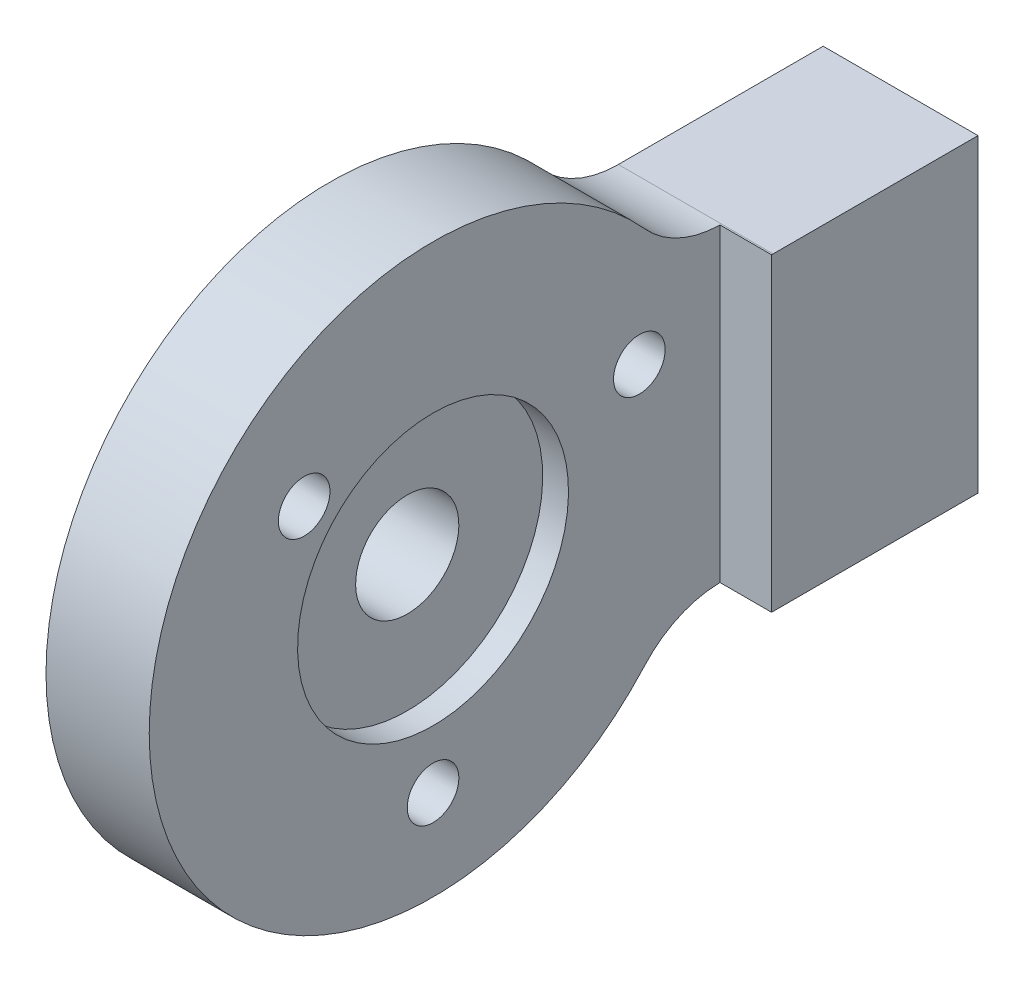
ISO-10303-21;
HEADER;
FILE_DESCRIPTION(('STEP AP214'),'2;1');
FILE_NAME('part.step','',(''),(''),'','','');
FILE_SCHEMA(('AUTOMOTIVE_DESIGN { 1 0 10303 214 1 1 1 1 }'));
ENDSEC;
DATA;
#1=APPLICATION_CONTEXT('core data for automotive mechanical design processes');
#2=APPLICATION_PROTOCOL_DEFINITION('international standard','automotive_design',2000,#1);
#3=PRODUCT_CONTEXT('',#1,'mechanical');
#4=PRODUCT('Part','Part','',(#3));
#5=PRODUCT_RELATED_PRODUCT_CATEGORY('part','',(#4));
#6=PRODUCT_DEFINITION_FORMATION('','',#4);
#7=PRODUCT_DEFINITION_CONTEXT('part definition',#1,'design');
#8=PRODUCT_DEFINITION('design','',#6,#7);
#9=PRODUCT_DEFINITION_SHAPE('','',#8);
#10=(LENGTH_UNIT() NAMED_UNIT(*) SI_UNIT(.MILLI.,.METRE.));
#11=(NAMED_UNIT(*) PLANE_ANGLE_UNIT() SI_UNIT($,.RADIAN.));
#12=(NAMED_UNIT(*) SI_UNIT($,.STERADIAN.) SOLID_ANGLE_UNIT());
#13=UNCERTAINTY_MEASURE_WITH_UNIT(LENGTH_MEASURE(1.E-05),#10,'distance_accuracy_value','');
#14=(GEOMETRIC_REPRESENTATION_CONTEXT(3) GLOBAL_UNCERTAINTY_ASSIGNED_CONTEXT((#13)) GLOBAL_UNIT_ASSIGNED_CONTEXT((#10,
#11,#12)) REPRESENTATION_CONTEXT('',''));
#15=CARTESIAN_POINT('',(0.,0.,0.));
#16=DIRECTION('',(0.,0.,1.));
#17=DIRECTION('',(1.,0.,0.));
#18=AXIS2_PLACEMENT_3D('',#15,#16,#17);
#19=CARTESIAN_POINT('',(-2.,6.,8.));
#20=DIRECTION('',(1.,0.,0.));
#21=DIRECTION('',(0.,1.,0.));
#22=AXIS2_PLACEMENT_3D('',#19,#20,#21);
#23=PLANE('',#22);
#24=CARTESIAN_POINT('',(-2.,0.,19.12));
#25=DIRECTION('',(1.,0.,0.));
#26=DIRECTION('',(0.,1.,0.));
#27=AXIS2_PLACEMENT_3D('',#24,#25,#26);
#28=CIRCLE('',#27,2.);
#29=CARTESIAN_POINT('',(-2.,2.,19.12));
#30=VERTEX_POINT('',#29);
#31=EDGE_CURVE('E122',#30,#30,#28,.F.);
#32=ORIENTED_EDGE('',*,*,#31,.F.);
#33=EDGE_LOOP('',(#32));
#34=FACE_BOUND('',#33,.T.);
#35=CARTESIAN_POINT('',(-2.,2.8839745962155,11.1248094716167));
#36=DIRECTION('',(-1.,0.,0.));
#37=DIRECTION('',(0.,0.499999999999992,-0.866025403784443));
#38=AXIS2_PLACEMENT_3D('',#35,#36,#37);
#39=CIRCLE('',#38,1.);
#40=CARTESIAN_POINT('',(-2.,3.38397459621549,10.2587840678322));
#41=VERTEX_POINT('',#40);
#42=EDGE_CURVE('E125',#41,#41,#39,.T.);
#43=ORIENTED_EDGE('',*,*,#42,.F.);
#44=EDGE_LOOP('',(#43));
#45=FACE_BOUND('',#44,.T.);
#46=CARTESIAN_POINT('',(-2.,4.61602540378447,24.1151905283833));
#47=DIRECTION('',(-1.,0.,0.));
#48=DIRECTION('',(0.,0.500000000000004,0.866025403784436));
#49=AXIS2_PLACEMENT_3D('',#46,#47,#48);
#50=CIRCLE('',#49,1.);
#51=CARTESIAN_POINT('',(-2.,5.11602540378447,24.9812159321677));
#52=VERTEX_POINT('',#51);
#53=EDGE_CURVE('E131',#52,#52,#50,.T.);
#54=ORIENTED_EDGE('',*,*,#53,.F.);
#55=EDGE_LOOP('',(#54));
#56=FACE_BOUND('',#55,.T.);
#57=CARTESIAN_POINT('',(-2.,-7.5,19.12));
#58=DIRECTION('',(-1.,0.,0.));
#59=DIRECTION('',(0.,-1.,0.));
#60=AXIS2_PLACEMENT_3D('',#57,#58,#59);
#61=CIRCLE('',#60,1.);
#62=CARTESIAN_POINT('',(-2.,-8.5,19.12));
#63=VERTEX_POINT('',#62);
#64=EDGE_CURVE('E137',#63,#63,#61,.T.);
#65=ORIENTED_EDGE('',*,*,#64,.F.);
#66=EDGE_LOOP('',(#65));
#67=FACE_BOUND('',#66,.T.);
#68=DIRECTION('',(0.,0.,-1.));
#69=VECTOR('',#68,1.);
#70=CARTESIAN_POINT('',(-2.,-6.,8.));
#71=LINE('',#70,#69);
#72=CARTESIAN_POINT('',(-2.,-6.,7.93966011250105));
#73=VERTEX_POINT('',#72);
#74=CARTESIAN_POINT('',(-2.,-6.,0.));
#75=VERTEX_POINT('',#74);
#76=EDGE_CURVE('E181',#73,#75,#71,.T.);
#77=ORIENTED_EDGE('',*,*,#76,.F.);
#78=CARTESIAN_POINT('',(-2.,-10.,7.93966011250105));
#79=DIRECTION('',(1.,0.,0.));
#80=DIRECTION('',(0.,1.,0.));
#81=AXIS2_PLACEMENT_3D('',#78,#79,#80);
#82=CIRCLE('',#81,4.);
#83=CARTESIAN_POINT('',(-2.,-7.33333333333333,10.9210840825008));
#84=VERTEX_POINT('',#83);
#85=EDGE_CURVE('E199',#73,#84,#82,.T.);
#86=ORIENTED_EDGE('',*,*,#85,.T.);
#87=CARTESIAN_POINT('',(-2.,0.,19.12));
#88=DIRECTION('',(1.,0.,0.));
#89=DIRECTION('',(0.,1.,0.));
#90=AXIS2_PLACEMENT_3D('',#87,#88,#89);
#91=CIRCLE('',#90,11.);
#92=CARTESIAN_POINT('',(-2.,7.33333333333333,10.9210840825008));
#93=VERTEX_POINT('',#92);
#94=EDGE_CURVE('E150',#93,#84,#91,.T.);
#95=ORIENTED_EDGE('',*,*,#94,.F.);
#96=CARTESIAN_POINT('',(-2.,10.,7.93966011250105));
#97=DIRECTION('',(1.,0.,0.));
#98=DIRECTION('',(0.,1.,0.));
#99=AXIS2_PLACEMENT_3D('',#96,#97,#98);
#100=CIRCLE('',#99,4.);
#101=CARTESIAN_POINT('',(-2.,6.,7.93966011250105));
#102=VERTEX_POINT('',#101);
#103=EDGE_CURVE('E11',#93,#102,#100,.T.);
#104=ORIENTED_EDGE('',*,*,#103,.T.);
#105=DIRECTION('',(0.,0.,-1.));
#106=VECTOR('',#105,1.);
#107=CARTESIAN_POINT('',(-2.,6.,8.));
#108=LINE('',#107,#106);
#109=CARTESIAN_POINT('',(-2.,6.,0.));
#110=VERTEX_POINT('',#109);
#111=EDGE_CURVE('E164',#102,#110,#108,.T.);
#112=ORIENTED_EDGE('',*,*,#111,.T.);
#113=DIRECTION('',(0.,-1.,0.));
#114=VECTOR('',#113,1.);
#115=CARTESIAN_POINT('',(-2.,6.,0.));
#116=LINE('',#115,#114);
#117=EDGE_CURVE('E162',#110,#75,#116,.T.);
#118=ORIENTED_EDGE('',*,*,#117,.T.);
#119=EDGE_LOOP('',(#77,#86,#95,#104,#112,#118));
#120=FACE_BOUND('',#119,.T.);
#121=ADVANCED_FACE('F36',(#34,#45,#56,#67,#120),#23,.F.);
#122=CARTESIAN_POINT('',(-2.,-6.,8.));
#123=DIRECTION('',(0.,1.,0.));
#124=DIRECTION('',(0.,0.,1.));
#125=AXIS2_PLACEMENT_3D('',#122,#123,#124);
#126=PLANE('',#125);
#127=DIRECTION('',(0.,0.,-1.));
#128=VECTOR('',#127,1.);
#129=CARTESIAN_POINT('',(4.,-6.,8.));
#130=LINE('',#129,#128);
#131=CARTESIAN_POINT('',(4.,-6.,7.93966011250105));
#132=VERTEX_POINT('',#131);
#133=CARTESIAN_POINT('',(4.,-6.,0.));
#134=VERTEX_POINT('',#133);
#135=EDGE_CURVE('E179',#132,#134,#130,.T.);
#136=ORIENTED_EDGE('',*,*,#135,.F.);
#137=DIRECTION('',(1.,0.,0.));
#138=VECTOR('',#137,1.);
#139=CARTESIAN_POINT('',(-2.,-6.,7.93966011250105));
#140=LINE('',#139,#138);
#141=EDGE_CURVE('E188',#132,#73,#140,.F.);
#142=ORIENTED_EDGE('',*,*,#141,.T.);
#143=ORIENTED_EDGE('',*,*,#76,.T.);
#144=DIRECTION('',(1.,0.,0.));
#145=VECTOR('',#144,1.);
#146=CARTESIAN_POINT('',(-2.,-6.,0.));
#147=LINE('',#146,#145);
#148=EDGE_CURVE('E168',#75,#134,#147,.T.);
#149=ORIENTED_EDGE('',*,*,#148,.T.);
#150=EDGE_LOOP('',(#136,#142,#143,#149));
#151=FACE_BOUND('',#150,.T.);
#152=ADVANCED_FACE('F238',(#151),#126,.F.);
#153=CARTESIAN_POINT('',(4.,6.,8.));
#154=DIRECTION('',(-1.,0.,0.));
#155=DIRECTION('',(0.,-1.,0.));
#156=AXIS2_PLACEMENT_3D('',#153,#154,#155);
#157=PLANE('',#156);
#158=DIRECTION('',(0.,1.,0.));
#159=VECTOR('',#158,1.);
#160=CARTESIAN_POINT('',(4.,6.,0.));
#161=LINE('',#160,#159);
#162=CARTESIAN_POINT('',(4.,6.,0.));
#163=VERTEX_POINT('',#162);
#164=EDGE_CURVE('E171',#134,#163,#161,.T.);
#165=ORIENTED_EDGE('',*,*,#164,.T.);
#166=DIRECTION('',(0.,0.,-1.));
#167=VECTOR('',#166,1.);
#168=CARTESIAN_POINT('',(4.,6.,8.));
#169=LINE('',#168,#167);
#170=CARTESIAN_POINT('',(4.,6.,7.93966011250105));
#171=VERTEX_POINT('',#170);
#172=EDGE_CURVE('E177',#171,#163,#169,.T.);
#173=ORIENTED_EDGE('',*,*,#172,.F.);
#174=CARTESIAN_POINT('',(4.,10.,7.93966011250105));
#175=DIRECTION('',(-1.,0.,0.));
#176=DIRECTION('',(0.,-1.,0.));
#177=AXIS2_PLACEMENT_3D('',#174,#175,#176);
#178=CIRCLE('',#177,4.);
#179=CARTESIAN_POINT('',(4.,6.00045513864682,8.));
#180=VERTEX_POINT('',#179);
#181=EDGE_CURVE('E201',#171,#180,#178,.T.);
#182=ORIENTED_EDGE('',*,*,#181,.T.);
#183=DIRECTION('',(0.,1.,0.));
#184=VECTOR('',#183,1.);
#185=CARTESIAN_POINT('',(4.,6.,8.));
#186=LINE('',#185,#184);
#187=CARTESIAN_POINT('',(4.,-6.00045513864682,8.));
#188=VERTEX_POINT('',#187);
#189=EDGE_CURVE('E58',#188,#180,#186,.T.);
#190=ORIENTED_EDGE('',*,*,#189,.F.);
#191=CARTESIAN_POINT('',(4.,-10.,7.93966011250105));
#192=DIRECTION('',(-1.,0.,0.));
#193=DIRECTION('',(0.,-1.,0.));
#194=AXIS2_PLACEMENT_3D('',#191,#192,#193);
#195=CIRCLE('',#194,4.);
#196=EDGE_CURVE('E197',#188,#132,#195,.T.);
#197=ORIENTED_EDGE('',*,*,#196,.T.);
#198=ORIENTED_EDGE('',*,*,#135,.T.);
#199=EDGE_LOOP('',(#165,#173,#182,#190,#197,#198));
#200=FACE_BOUND('',#199,.T.);
#201=ADVANCED_FACE('F236',(#200),#157,.F.);
#202=CARTESIAN_POINT('',(-2.,6.,8.));
#203=DIRECTION('',(0.,-1.,0.));
#204=DIRECTION('',(0.,0.,-1.));
#205=AXIS2_PLACEMENT_3D('',#202,#203,#204);
#206=PLANE('',#205);
#207=ORIENTED_EDGE('',*,*,#111,.F.);
#208=DIRECTION('',(1.,0.,0.));
#209=VECTOR('',#208,1.);
#210=CARTESIAN_POINT('',(-2.,6.,7.93966011250105));
#211=LINE('',#210,#209);
#212=EDGE_CURVE('E190',#102,#171,#211,.T.);
#213=ORIENTED_EDGE('',*,*,#212,.T.);
#214=ORIENTED_EDGE('',*,*,#172,.T.);
#215=DIRECTION('',(-1.,0.,0.));
#216=VECTOR('',#215,1.);
#217=CARTESIAN_POINT('',(-2.,6.,0.));
#218=LINE('',#217,#216);
#219=EDGE_CURVE('E165',#163,#110,#218,.T.);
#220=ORIENTED_EDGE('',*,*,#219,.T.);
#221=EDGE_LOOP('',(#207,#213,#214,#220));
#222=FACE_BOUND('',#221,.T.);
#223=ADVANCED_FACE('F220',(#222),#206,.F.);
#224=CARTESIAN_POINT('',(-2.,-6.,8.));
#225=DIRECTION('',(0.,0.,1.));
#226=DIRECTION('',(1.,0.,0.));
#227=AXIS2_PLACEMENT_3D('',#224,#225,#226);
#228=PLANE('',#227);
#229=DIRECTION('',(0.,1.,0.));
#230=VECTOR('',#229,1.);
#231=CARTESIAN_POINT('',(2.,4.3,8.));
#232=LINE('',#231,#230);
#233=CARTESIAN_POINT('',(2.,-6.00045513864682,8.));
#234=VERTEX_POINT('',#233);
#235=CARTESIAN_POINT('',(2.,6.00045513864682,8.));
#236=VERTEX_POINT('',#235);
#237=EDGE_CURVE('E51',#234,#236,#232,.T.);
#238=ORIENTED_EDGE('',*,*,#237,.F.);
#239=DIRECTION('',(1.,0.,0.));
#240=VECTOR('',#239,1.);
#241=CARTESIAN_POINT('',(2.,-6.00045513864682,8.));
#242=LINE('',#241,#240);
#243=EDGE_CURVE('E195',#234,#188,#242,.T.);
#244=ORIENTED_EDGE('',*,*,#243,.T.);
#245=ORIENTED_EDGE('',*,*,#189,.T.);
#246=DIRECTION('',(1.,0.,0.));
#247=VECTOR('',#246,1.);
#248=CARTESIAN_POINT('',(4.,6.00045513864682,8.));
#249=LINE('',#248,#247);
#250=EDGE_CURVE('E203',#180,#236,#249,.F.);
#251=ORIENTED_EDGE('',*,*,#250,.T.);
#252=EDGE_LOOP('',(#238,#244,#245,#251));
#253=FACE_BOUND('',#252,.T.);
#254=ADVANCED_FACE('F234',(#253),#228,.T.);
#255=CARTESIAN_POINT('',(-2.,-6.,0.));
#256=DIRECTION('',(0.,0.,1.));
#257=DIRECTION('',(1.,0.,0.));
#258=AXIS2_PLACEMENT_3D('',#255,#256,#257);
#259=PLANE('',#258);
#260=CARTESIAN_POINT('',(1.,-3.,0.));
#261=DIRECTION('',(0.,0.,-1.));
#262=DIRECTION('',(-1.,0.,0.));
#263=AXIS2_PLACEMENT_3D('',#260,#261,#262);
#264=CIRCLE('',#263,1.25);
#265=CARTESIAN_POINT('',(-0.249999999999999,-3.,0.));
#266=VERTEX_POINT('',#265);
#267=EDGE_CURVE('E153',#266,#266,#264,.T.);
#268=ORIENTED_EDGE('',*,*,#267,.F.);
#269=EDGE_LOOP('',(#268));
#270=FACE_BOUND('',#269,.T.);
#271=CARTESIAN_POINT('',(1.,3.,0.));
#272=DIRECTION('',(0.,0.,-1.));
#273=DIRECTION('',(-1.,0.,0.));
#274=AXIS2_PLACEMENT_3D('',#271,#272,#273);
#275=CIRCLE('',#274,1.25);
#276=CARTESIAN_POINT('',(-0.249999999999999,3.,0.));
#277=VERTEX_POINT('',#276);
#278=EDGE_CURVE('E158',#277,#277,#275,.T.);
#279=ORIENTED_EDGE('',*,*,#278,.F.);
#280=EDGE_LOOP('',(#279));
#281=FACE_BOUND('',#280,.T.);
#282=ORIENTED_EDGE('',*,*,#117,.F.);
#283=ORIENTED_EDGE('',*,*,#219,.F.);
#284=ORIENTED_EDGE('',*,*,#164,.F.);
#285=ORIENTED_EDGE('',*,*,#148,.F.);
#286=EDGE_LOOP('',(#282,#283,#284,#285));
#287=FACE_BOUND('',#286,.T.);
#288=ADVANCED_FACE('F227',(#270,#281,#287),#259,.F.);
#289=CARTESIAN_POINT('',(2.,4.3,9.));
#290=DIRECTION('',(-1.,0.,0.));
#291=DIRECTION('',(0.,-1.,0.));
#292=AXIS2_PLACEMENT_3D('',#289,#290,#291);
#293=PLANE('',#292);
#294=CARTESIAN_POINT('',(2.,2.8839745962155,11.1248094716167));
#295=DIRECTION('',(-1.,0.,0.));
#296=DIRECTION('',(0.,-1.,0.));
#297=AXIS2_PLACEMENT_3D('',#294,#295,#296);
#298=CIRCLE('',#297,1.);
#299=CARTESIAN_POINT('',(2.,1.8839745962155,11.1248094716167));
#300=VERTEX_POINT('',#299);
#301=EDGE_CURVE('E128',#300,#300,#298,.F.);
#302=ORIENTED_EDGE('',*,*,#301,.F.);
#303=EDGE_LOOP('',(#302));
#304=FACE_BOUND('',#303,.T.);
#305=CARTESIAN_POINT('',(2.,4.61602540378447,24.1151905283833));
#306=DIRECTION('',(-1.,0.,0.));
#307=DIRECTION('',(0.,-1.,0.));
#308=AXIS2_PLACEMENT_3D('',#305,#306,#307);
#309=CIRCLE('',#308,1.);
#310=CARTESIAN_POINT('',(2.,3.61602540378447,24.1151905283833));
#311=VERTEX_POINT('',#310);
#312=EDGE_CURVE('E134',#311,#311,#309,.F.);
#313=ORIENTED_EDGE('',*,*,#312,.F.);
#314=EDGE_LOOP('',(#313));
#315=FACE_BOUND('',#314,.T.);
#316=CARTESIAN_POINT('',(2.,-7.5,19.12));
#317=DIRECTION('',(-1.,0.,0.));
#318=DIRECTION('',(0.,-1.,0.));
#319=AXIS2_PLACEMENT_3D('',#316,#317,#318);
#320=CIRCLE('',#319,1.);
#321=CARTESIAN_POINT('',(2.,-8.5,19.12));
#322=VERTEX_POINT('',#321);
#323=EDGE_CURVE('E140',#322,#322,#320,.F.);
#324=ORIENTED_EDGE('',*,*,#323,.F.);
#325=EDGE_LOOP('',(#324));
#326=FACE_BOUND('',#325,.T.);
#327=CARTESIAN_POINT('',(2.,0.,19.12));
#328=DIRECTION('',(1.,0.,0.));
#329=DIRECTION('',(0.,1.,0.));
#330=AXIS2_PLACEMENT_3D('',#327,#328,#329);
#331=CIRCLE('',#330,5.25);
#332=CARTESIAN_POINT('',(2.,5.25,19.12));
#333=VERTEX_POINT('',#332);
#334=EDGE_CURVE('E143',#333,#333,#331,.T.);
#335=ORIENTED_EDGE('',*,*,#334,.F.);
#336=EDGE_LOOP('',(#335));
#337=FACE_BOUND('',#336,.T.);
#338=CARTESIAN_POINT('',(2.,0.,19.12));
#339=DIRECTION('',(1.,0.,0.));
#340=DIRECTION('',(0.,1.,0.));
#341=AXIS2_PLACEMENT_3D('',#338,#339,#340);
#342=CIRCLE('',#341,11.);
#343=CARTESIAN_POINT('',(2.,7.33333333333333,10.9210840825008));
#344=VERTEX_POINT('',#343);
#345=CARTESIAN_POINT('',(2.,-7.33333333333333,10.9210840825008));
#346=VERTEX_POINT('',#345);
#347=EDGE_CURVE('E147',#344,#346,#342,.T.);
#348=ORIENTED_EDGE('',*,*,#347,.T.);
#349=CARTESIAN_POINT('',(2.,-10.,7.93966011250105));
#350=DIRECTION('',(-1.,0.,0.));
#351=DIRECTION('',(0.,-1.,0.));
#352=AXIS2_PLACEMENT_3D('',#349,#350,#351);
#353=CIRCLE('',#352,4.);
#354=EDGE_CURVE('E193',#346,#234,#353,.T.);
#355=ORIENTED_EDGE('',*,*,#354,.T.);
#356=ORIENTED_EDGE('',*,*,#237,.T.);
#357=CARTESIAN_POINT('',(2.,10.,7.93966011250105));
#358=DIRECTION('',(-1.,0.,0.));
#359=DIRECTION('',(0.,-1.,0.));
#360=AXIS2_PLACEMENT_3D('',#357,#358,#359);
#361=CIRCLE('',#360,4.);
#362=EDGE_CURVE('E44',#236,#344,#361,.T.);
#363=ORIENTED_EDGE('',*,*,#362,.T.);
#364=EDGE_LOOP('',(#348,#355,#356,#363));
#365=FACE_BOUND('',#364,.T.);
#366=ADVANCED_FACE('F206',(#304,#315,#326,#337,#365),#293,.F.);
#367=CARTESIAN_POINT('',(1.,3.,6.));
#368=DIRECTION('',(0.,0.,-1.));
#369=DIRECTION('',(-1.,0.,0.));
#370=AXIS2_PLACEMENT_3D('',#367,#368,#369);
#371=CYLINDRICAL_SURFACE('',#370,1.25);
#372=CARTESIAN_POINT('',(1.,3.,6.));
#373=DIRECTION('',(0.,0.,-1.));
#374=DIRECTION('',(-1.,0.,0.));
#375=AXIS2_PLACEMENT_3D('',#372,#373,#374);
#376=CIRCLE('',#375,1.25);
#377=CARTESIAN_POINT('',(-0.249999999999997,3.,6.));
#378=VERTEX_POINT('',#377);
#379=EDGE_CURVE('E112',#378,#378,#376,.T.);
#380=ORIENTED_EDGE('',*,*,#379,.F.);
#381=EDGE_LOOP('',(#380));
#382=FACE_BOUND('',#381,.T.);
#383=ORIENTED_EDGE('',*,*,#278,.T.);
#384=EDGE_LOOP('',(#383));
#385=FACE_BOUND('',#384,.T.);
#386=ADVANCED_FACE('F282',(#382,#385),#371,.F.);
#387=CARTESIAN_POINT('',(1.,-3.,6.));
#388=DIRECTION('',(0.,0.,-1.));
#389=DIRECTION('',(-1.,0.,0.));
#390=AXIS2_PLACEMENT_3D('',#387,#388,#389);
#391=CYLINDRICAL_SURFACE('',#390,1.25);
#392=CARTESIAN_POINT('',(1.,-3.,6.));
#393=DIRECTION('',(0.,0.,-1.));
#394=DIRECTION('',(-1.,0.,0.));
#395=AXIS2_PLACEMENT_3D('',#392,#393,#394);
#396=CIRCLE('',#395,1.25);
#397=CARTESIAN_POINT('',(-0.249999999999997,-3.,6.));
#398=VERTEX_POINT('',#397);
#399=EDGE_CURVE('E114',#398,#398,#396,.T.);
#400=ORIENTED_EDGE('',*,*,#399,.F.);
#401=EDGE_LOOP('',(#400));
#402=FACE_BOUND('',#401,.T.);
#403=ORIENTED_EDGE('',*,*,#267,.T.);
#404=EDGE_LOOP('',(#403));
#405=FACE_BOUND('',#404,.T.);
#406=ADVANCED_FACE('F270',(#402,#405),#391,.F.);
#407=CARTESIAN_POINT('',(-2.,0.,19.12));
#408=DIRECTION('',(1.,0.,0.));
#409=DIRECTION('',(0.,1.,0.));
#410=AXIS2_PLACEMENT_3D('',#407,#408,#409);
#411=CYLINDRICAL_SURFACE('',#410,11.);
#412=ORIENTED_EDGE('',*,*,#94,.T.);
#413=DIRECTION('',(1.,0.,0.));
#414=VECTOR('',#413,1.);
#415=CARTESIAN_POINT('',(-2.,-7.33333333333333,10.9210840825008));
#416=LINE('',#415,#414);
#417=EDGE_CURVE('E185',#84,#346,#416,.T.);
#418=ORIENTED_EDGE('',*,*,#417,.T.);
#419=ORIENTED_EDGE('',*,*,#347,.F.);
#420=DIRECTION('',(1.,0.,0.));
#421=VECTOR('',#420,1.);
#422=CARTESIAN_POINT('',(-2.,7.33333333333333,10.9210840825008));
#423=LINE('',#422,#421);
#424=EDGE_CURVE('E183',#344,#93,#423,.F.);
#425=ORIENTED_EDGE('',*,*,#424,.T.);
#426=EDGE_LOOP('',(#412,#418,#419,#425));
#427=FACE_BOUND('',#426,.T.);
#428=ADVANCED_FACE('F211',(#427),#411,.T.);
#429=CARTESIAN_POINT('',(1.,0.,19.12));
#430=DIRECTION('',(1.,0.,0.));
#431=DIRECTION('',(0.,1.,0.));
#432=AXIS2_PLACEMENT_3D('',#429,#430,#431);
#433=CYLINDRICAL_SURFACE('',#432,5.25);
#434=CARTESIAN_POINT('',(1.,0.,19.12));
#435=DIRECTION('',(1.,0.,0.));
#436=DIRECTION('',(0.,1.,0.));
#437=AXIS2_PLACEMENT_3D('',#434,#435,#436);
#438=CIRCLE('',#437,5.25);
#439=CARTESIAN_POINT('',(0.999999999999999,5.25,19.12));
#440=VERTEX_POINT('',#439);
#441=EDGE_CURVE('E144',#440,#440,#438,.T.);
#442=ORIENTED_EDGE('',*,*,#441,.F.);
#443=EDGE_LOOP('',(#442));
#444=FACE_BOUND('',#443,.T.);
#445=ORIENTED_EDGE('',*,*,#334,.T.);
#446=EDGE_LOOP('',(#445));
#447=FACE_BOUND('',#446,.T.);
#448=ADVANCED_FACE('F269',(#444,#447),#433,.F.);
#449=CARTESIAN_POINT('',(1.,0.,19.12));
#450=DIRECTION('',(1.,0.,0.));
#451=DIRECTION('',(0.,1.,0.));
#452=AXIS2_PLACEMENT_3D('',#449,#450,#451);
#453=PLANE('',#452);
#454=CARTESIAN_POINT('',(1.,0.,19.12));
#455=DIRECTION('',(1.,0.,0.));
#456=DIRECTION('',(0.,1.,0.));
#457=AXIS2_PLACEMENT_3D('',#454,#455,#456);
#458=CIRCLE('',#457,2.);
#459=CARTESIAN_POINT('',(0.999999999999999,2.,19.12));
#460=VERTEX_POINT('',#459);
#461=EDGE_CURVE('E117',#460,#460,#458,.T.);
#462=ORIENTED_EDGE('',*,*,#461,.F.);
#463=EDGE_LOOP('',(#462));
#464=FACE_BOUND('',#463,.T.);
#465=ORIENTED_EDGE('',*,*,#441,.T.);
#466=EDGE_LOOP('',(#465));
#467=FACE_BOUND('',#466,.T.);
#468=ADVANCED_FACE('F354',(#464,#467),#453,.T.);
#469=CARTESIAN_POINT('',(4.82842712474619,-7.5,19.12));
#470=DIRECTION('',(-1.,0.,0.));
#471=DIRECTION('',(0.,-1.,0.));
#472=AXIS2_PLACEMENT_3D('',#469,#470,#471);
#473=CYLINDRICAL_SURFACE('',#472,1.);
#474=CARTESIAN_POINT('',(2.,-8.5,19.12));
#475=CARTESIAN_POINT('',(1.95833333333333,-8.5,19.12));
#476=CARTESIAN_POINT('',(1.91666666666667,-8.5,19.12));
#477=CARTESIAN_POINT('',(1.83333333333333,-8.5,19.12));
#478=CARTESIAN_POINT('',(1.79166666666667,-8.5,19.12));
#479=CARTESIAN_POINT('',(1.70833333333333,-8.5,19.12));
#480=CARTESIAN_POINT('',(1.66666666666667,-8.5,19.12));
#481=CARTESIAN_POINT('',(1.58333333333333,-8.5,19.12));
#482=CARTESIAN_POINT('',(1.54166666666667,-8.5,19.12));
#483=CARTESIAN_POINT('',(1.45833333333333,-8.5,19.12));
#484=CARTESIAN_POINT('',(1.41666666666667,-8.5,19.12));
#485=CARTESIAN_POINT('',(1.33333333333333,-8.5,19.12));
#486=CARTESIAN_POINT('',(1.29166666666667,-8.5,19.12));
#487=CARTESIAN_POINT('',(1.20833333333333,-8.5,19.12));
#488=CARTESIAN_POINT('',(1.16666666666667,-8.5,19.12));
#489=CARTESIAN_POINT('',(1.08333333333333,-8.5,19.12));
#490=CARTESIAN_POINT('',(1.04166666666667,-8.5,19.12));
#491=CARTESIAN_POINT('',(0.958333333333334,-8.5,19.12));
#492=CARTESIAN_POINT('',(0.916666666666667,-8.5,19.12));
#493=CARTESIAN_POINT('',(0.833333333333334,-8.5,19.12));
#494=CARTESIAN_POINT('',(0.791666666666667,-8.5,19.12));
#495=CARTESIAN_POINT('',(0.708333333333334,-8.5,19.12));
#496=CARTESIAN_POINT('',(0.666666666666668,-8.5,19.12));
#497=CARTESIAN_POINT('',(0.583333333333335,-8.5,19.12));
#498=CARTESIAN_POINT('',(0.541666666666668,-8.5,19.12));
#499=CARTESIAN_POINT('',(0.458333333333335,-8.5,19.12));
#500=CARTESIAN_POINT('',(0.416666666666668,-8.5,19.12));
#501=CARTESIAN_POINT('',(0.333333333333335,-8.5,19.12));
#502=CARTESIAN_POINT('',(0.291666666666668,-8.5,19.12));
#503=CARTESIAN_POINT('',(0.208333333333334,-8.5,19.12));
#504=CARTESIAN_POINT('',(0.166666666666668,-8.5,19.12));
#505=CARTESIAN_POINT('',(0.0833333333333343,-8.5,19.12));
#506=CARTESIAN_POINT('',(0.0416666666666676,-8.5,19.12));
#507=CARTESIAN_POINT('',(-0.0416666666666658,-8.5,19.12));
#508=CARTESIAN_POINT('',(-0.0833333333333325,-8.5,19.12));
#509=CARTESIAN_POINT('',(-0.166666666666666,-8.5,19.12));
#510=CARTESIAN_POINT('',(-0.208333333333333,-8.5,19.12));
#511=CARTESIAN_POINT('',(-0.291666666666666,-8.5,19.12));
#512=CARTESIAN_POINT('',(-0.333333333333333,-8.5,19.12));
#513=CARTESIAN_POINT('',(-0.416666666666666,-8.5,19.12));
#514=CARTESIAN_POINT('',(-0.458333333333333,-8.5,19.12));
#515=CARTESIAN_POINT('',(-0.541666666666666,-8.5,19.12));
#516=CARTESIAN_POINT('',(-0.583333333333333,-8.5,19.12));
#517=CARTESIAN_POINT('',(-0.666666666666666,-8.5,19.12));
#518=CARTESIAN_POINT('',(-0.708333333333332,-8.5,19.12));
#519=CARTESIAN_POINT('',(-0.791666666666666,-8.5,19.12));
#520=CARTESIAN_POINT('',(-0.833333333333332,-8.5,19.12));
#521=CARTESIAN_POINT('',(-0.916666666666666,-8.5,19.12));
#522=CARTESIAN_POINT('',(-0.958333333333332,-8.5,19.12));
#523=CARTESIAN_POINT('',(-1.04166666666667,-8.5,19.12));
#524=CARTESIAN_POINT('',(-1.08333333333333,-8.5,19.12));
#525=CARTESIAN_POINT('',(-1.16666666666667,-8.5,19.12));
#526=CARTESIAN_POINT('',(-1.20833333333333,-8.5,19.12));
#527=CARTESIAN_POINT('',(-1.29166666666667,-8.5,19.12));
#528=CARTESIAN_POINT('',(-1.33333333333333,-8.5,19.12));
#529=CARTESIAN_POINT('',(-1.41666666666667,-8.5,19.12));
#530=CARTESIAN_POINT('',(-1.45833333333333,-8.5,19.12));
#531=CARTESIAN_POINT('',(-1.54166666666667,-8.5,19.12));
#532=CARTESIAN_POINT('',(-1.58333333333333,-8.5,19.12));
#533=CARTESIAN_POINT('',(-1.66666666666667,-8.5,19.12));
#534=CARTESIAN_POINT('',(-1.70833333333333,-8.5,19.12));
#535=CARTESIAN_POINT('',(-1.79166666666667,-8.5,19.12));
#536=CARTESIAN_POINT('',(-1.83333333333333,-8.5,19.12));
#537=CARTESIAN_POINT('',(-1.91666666666667,-8.5,19.12));
#538=CARTESIAN_POINT('',(-1.95833333333333,-8.5,19.12));
#539=CARTESIAN_POINT('',(-2.,-8.5,19.12));
#540=B_SPLINE_CURVE_WITH_KNOTS('',3,(#474,#475,#476,#477,#478,#479,#480,#481,#482,#483,#484,
#485,#486,#487,#488,#489,#490,#491,#492,#493,#494,#495,#496,#497,#498,#499,#500,#501,#502,#503,
#504,#505,#506,#507,#508,#509,#510,#511,#512,#513,#514,#515,#516,#517,#518,#519,#520,#521,#522,
#523,#524,#525,#526,#527,#528,#529,#530,#531,#532,#533,#534,#535,#536,#537,#538,#539),
.UNSPECIFIED.,.F.,.F.,(4,2,2,2,2,2,2,2,2,2,2,2,2,2,2,2,2,2,2,2,2,2,2,2,2,2,2,2,2,2,2,2,4),(0.,
0.125,0.25,0.375,0.5,0.625,0.75,0.875,1.,1.125,1.25,1.375,1.5,1.625,1.75,1.875,2.,2.125,2.25,
2.375,2.5,2.625,2.75,2.875,3.,3.125,3.25,3.375,3.5,3.625,3.75,3.875,4.),.UNSPECIFIED.);
#541=EDGE_CURVE('BSEAM359',#322,#63,#540,.T.);
#542=ORIENTED_EDGE('',*,*,#323,.T.);
#543=ORIENTED_EDGE('',*,*,#64,.T.);
#544=ORIENTED_EDGE('',*,*,#541,.T.);
#545=ORIENTED_EDGE('',*,*,#541,.F.);
#546=EDGE_LOOP('',(#542,#544,#543,#545));
#547=FACE_BOUND('',#546,.T.);
#548=ADVANCED_FACE('F359',(#547),#473,.F.);
#549=CARTESIAN_POINT('',(4.82842712474619,4.61602540378447,24.1151905283833));
#550=DIRECTION('',(-1.,0.,0.));
#551=DIRECTION('',(0.,-1.,0.));
#552=AXIS2_PLACEMENT_3D('',#549,#550,#551);
#553=CYLINDRICAL_SURFACE('',#552,1.);
#554=ORIENTED_EDGE('',*,*,#312,.T.);
#555=EDGE_LOOP('',(#554));
#556=FACE_BOUND('',#555,.T.);
#557=ORIENTED_EDGE('',*,*,#53,.T.);
#558=EDGE_LOOP('',(#557));
#559=FACE_BOUND('',#558,.T.);
#560=ADVANCED_FACE('F369',(#556,#559),#553,.F.);
#561=CARTESIAN_POINT('',(4.82842712474619,2.8839745962155,11.1248094716167));
#562=DIRECTION('',(-1.,0.,0.));
#563=DIRECTION('',(0.,-1.,0.));
#564=AXIS2_PLACEMENT_3D('',#561,#562,#563);
#565=CYLINDRICAL_SURFACE('',#564,1.);
#566=ORIENTED_EDGE('',*,*,#301,.T.);
#567=EDGE_LOOP('',(#566));
#568=FACE_BOUND('',#567,.T.);
#569=ORIENTED_EDGE('',*,*,#42,.T.);
#570=EDGE_LOOP('',(#569));
#571=FACE_BOUND('',#570,.T.);
#572=ADVANCED_FACE('F346',(#568,#571),#565,.F.);
#573=CARTESIAN_POINT('',(-7.65685424949239,0.,19.12));
#574=DIRECTION('',(1.,0.,0.));
#575=DIRECTION('',(0.,1.,0.));
#576=AXIS2_PLACEMENT_3D('',#573,#574,#575);
#577=CYLINDRICAL_SURFACE('',#576,2.);
#578=ORIENTED_EDGE('',*,*,#31,.T.);
#579=EDGE_LOOP('',(#578));
#580=FACE_BOUND('',#579,.T.);
#581=ORIENTED_EDGE('',*,*,#461,.T.);
#582=EDGE_LOOP('',(#581));
#583=FACE_BOUND('',#582,.T.);
#584=ADVANCED_FACE('F336',(#580,#583),#577,.F.);
#585=CARTESIAN_POINT('',(1.,-3.,6.));
#586=DIRECTION('',(0.,0.,-1.));
#587=DIRECTION('',(-1.,0.,0.));
#588=AXIS2_PLACEMENT_3D('',#585,#586,#587);
#589=CONICAL_SURFACE('',#588,1.25,1.02974425867665);
#590=CARTESIAN_POINT('',(1.,-3.,6.75107577378445));
#591=VERTEX_POINT('',#590);
#592=VERTEX_LOOP('',#591);
#593=FACE_BOUND('',#592,.T.);
#594=ORIENTED_EDGE('',*,*,#399,.T.);
#595=EDGE_LOOP('',(#594));
#596=FACE_BOUND('',#595,.T.);
#597=ADVANCED_FACE('F108',(#593,#596),#589,.F.);
#598=CARTESIAN_POINT('',(1.,3.,6.));
#599=DIRECTION('',(0.,0.,-1.));
#600=DIRECTION('',(-1.,0.,0.));
#601=AXIS2_PLACEMENT_3D('',#598,#599,#600);
#602=CONICAL_SURFACE('',#601,1.25,1.02974425867665);
#603=CARTESIAN_POINT('',(1.,3.,6.75107577378445));
#604=VERTEX_POINT('',#603);
#605=VERTEX_LOOP('',#604);
#606=FACE_BOUND('',#605,.T.);
#607=ORIENTED_EDGE('',*,*,#379,.T.);
#608=EDGE_LOOP('',(#607));
#609=FACE_BOUND('',#608,.T.);
#610=ADVANCED_FACE('F104',(#606,#609),#602,.F.);
#611=CARTESIAN_POINT('',(-2.,-10.,7.93966011250105));
#612=DIRECTION('',(1.,0.,0.));
#613=DIRECTION('',(0.,1.,0.));
#614=AXIS2_PLACEMENT_3D('',#611,#612,#613);
#615=CYLINDRICAL_SURFACE('',#614,4.);
#616=ORIENTED_EDGE('',*,*,#85,.F.);
#617=ORIENTED_EDGE('',*,*,#141,.F.);
#618=ORIENTED_EDGE('',*,*,#196,.F.);
#619=ORIENTED_EDGE('',*,*,#243,.F.);
#620=ORIENTED_EDGE('',*,*,#354,.F.);
#621=ORIENTED_EDGE('',*,*,#417,.F.);
#622=EDGE_LOOP('',(#616,#617,#618,#619,#620,#621));
#623=FACE_BOUND('',#622,.T.);
#624=ADVANCED_FACE('F107',(#623),#615,.F.);
#625=CARTESIAN_POINT('',(-2.,10.,7.93966011250105));
#626=DIRECTION('',(1.,0.,0.));
#627=DIRECTION('',(0.,1.,0.));
#628=AXIS2_PLACEMENT_3D('',#625,#626,#627);
#629=CYLINDRICAL_SURFACE('',#628,4.);
#630=ORIENTED_EDGE('',*,*,#103,.F.);
#631=ORIENTED_EDGE('',*,*,#424,.F.);
#632=ORIENTED_EDGE('',*,*,#362,.F.);
#633=ORIENTED_EDGE('',*,*,#250,.F.);
#634=ORIENTED_EDGE('',*,*,#181,.F.);
#635=ORIENTED_EDGE('',*,*,#212,.F.);
#636=EDGE_LOOP('',(#630,#631,#632,#633,#634,#635));
#637=FACE_BOUND('',#636,.T.);
#638=ADVANCED_FACE('F38',(#637),#629,.F.);
#639=CLOSED_SHELL('',(#121,#152,#201,#223,#254,#288,#366,#386,#406,#428,#448,#468,#548,#560,
#572,#584,#597,#610,#624,#638));
#640=MANIFOLD_SOLID_BREP('B2',#639);
#641=ADVANCED_BREP_SHAPE_REPRESENTATION('',(#18,#640),#14);
#642=SHAPE_DEFINITION_REPRESENTATION(#9,#641);
ENDSEC;
END-ISO-10303-21;
